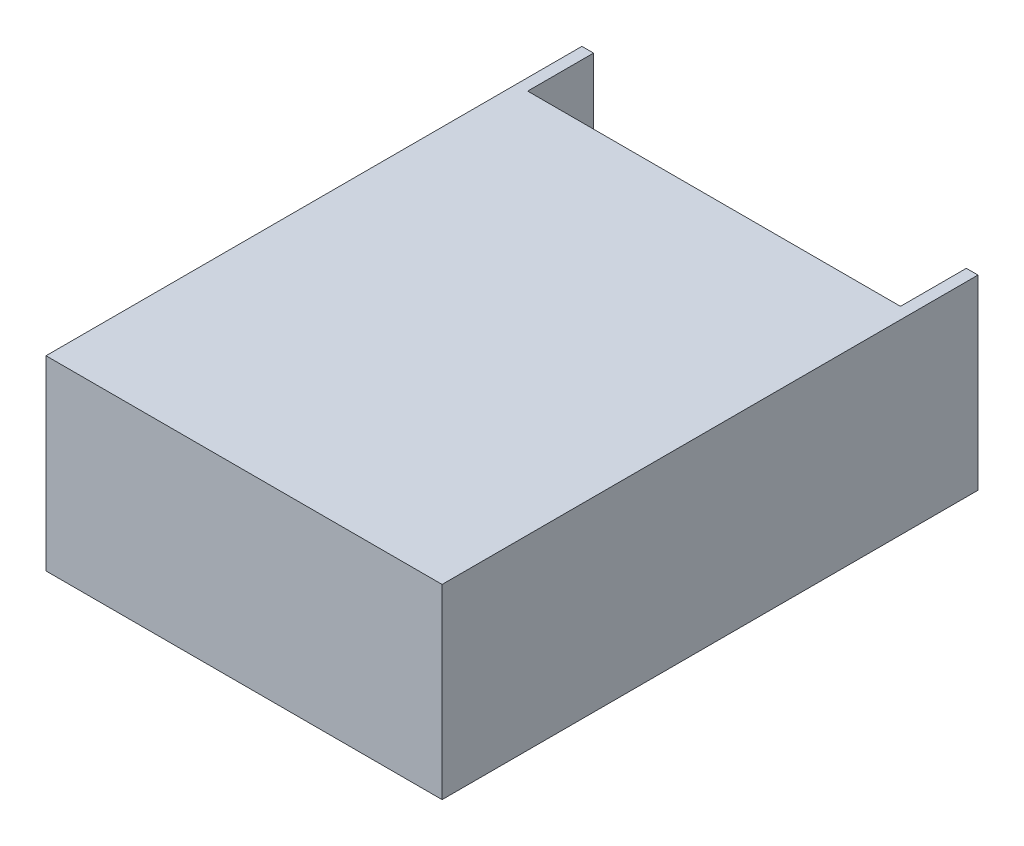
ISO-10303-21;
HEADER;
FILE_DESCRIPTION(('STEP AP214'),'2;1');
FILE_NAME('part.step','',(''),(''),'','','');
FILE_SCHEMA(('AUTOMOTIVE_DESIGN { 1 0 10303 214 1 1 1 1 }'));
ENDSEC;
DATA;
#1=APPLICATION_CONTEXT('core data for automotive mechanical design processes');
#2=APPLICATION_PROTOCOL_DEFINITION('international standard','automotive_design',2000,#1);
#3=PRODUCT_CONTEXT('',#1,'mechanical');
#4=PRODUCT('Part','Part','',(#3));
#5=PRODUCT_RELATED_PRODUCT_CATEGORY('part','',(#4));
#6=PRODUCT_DEFINITION_FORMATION('','',#4);
#7=PRODUCT_DEFINITION_CONTEXT('part definition',#1,'design');
#8=PRODUCT_DEFINITION('design','',#6,#7);
#9=PRODUCT_DEFINITION_SHAPE('','',#8);
#10=(LENGTH_UNIT() NAMED_UNIT(*) SI_UNIT(.MILLI.,.METRE.));
#11=(NAMED_UNIT(*) PLANE_ANGLE_UNIT() SI_UNIT($,.RADIAN.));
#12=(NAMED_UNIT(*) SI_UNIT($,.STERADIAN.) SOLID_ANGLE_UNIT());
#13=UNCERTAINTY_MEASURE_WITH_UNIT(LENGTH_MEASURE(1.E-05),#10,'distance_accuracy_value','');
#14=(GEOMETRIC_REPRESENTATION_CONTEXT(3) GLOBAL_UNCERTAINTY_ASSIGNED_CONTEXT((#13)) GLOBAL_UNIT_ASSIGNED_CONTEXT((#10,
#11,#12)) REPRESENTATION_CONTEXT('',''));
#15=CARTESIAN_POINT('',(0.,0.,0.));
#16=DIRECTION('',(0.,0.,1.));
#17=DIRECTION('',(1.,0.,0.));
#18=AXIS2_PLACEMENT_3D('',#15,#16,#17);
#19=CARTESIAN_POINT('',(0.,0.5,-23.));
#20=DIRECTION('',(0.,0.,-1.));
#21=DIRECTION('',(-1.,0.,0.));
#22=AXIS2_PLACEMENT_3D('',#19,#20,#21);
#23=PLANE('',#22);
#24=DIRECTION('',(0.,1.,0.));
#25=VECTOR('',#24,1.);
#26=CARTESIAN_POINT('',(10.7860933901248,0.,-23.));
#27=LINE('',#26,#25);
#28=CARTESIAN_POINT('',(10.7860933901248,0.,-23.));
#29=VERTEX_POINT('',#28);
#30=CARTESIAN_POINT('',(10.7860933901248,0.5,-23.));
#31=VERTEX_POINT('',#30);
#32=EDGE_CURVE('E158',#29,#31,#27,.T.);
#33=ORIENTED_EDGE('',*,*,#32,.F.);
#34=DIRECTION('',(1.,0.,0.));
#35=VECTOR('',#34,1.);
#36=CARTESIAN_POINT('',(0.,0.,-23.));
#37=LINE('',#36,#35);
#38=CARTESIAN_POINT('',(5.53846992642918,0.,-23.));
#39=VERTEX_POINT('',#38);
#40=EDGE_CURVE('E169',#39,#29,#37,.T.);
#41=ORIENTED_EDGE('',*,*,#40,.F.);
#42=DIRECTION('',(0.,1.,0.));
#43=VECTOR('',#42,1.);
#44=CARTESIAN_POINT('',(5.53846992642918,0.,-23.));
#45=LINE('',#44,#43);
#46=CARTESIAN_POINT('',(5.53846992642918,0.5,-23.));
#47=VERTEX_POINT('',#46);
#48=EDGE_CURVE('E313',#39,#47,#45,.T.);
#49=ORIENTED_EDGE('',*,*,#48,.T.);
#50=DIRECTION('',(1.,0.,0.));
#51=VECTOR('',#50,1.);
#52=CARTESIAN_POINT('',(0.,0.5,-23.));
#53=LINE('',#52,#51);
#54=EDGE_CURVE('E171',#47,#31,#53,.T.);
#55=ORIENTED_EDGE('',*,*,#54,.T.);
#56=EDGE_LOOP('',(#33,#41,#49,#55));
#57=FACE_BOUND('',#56,.T.);
#58=ADVANCED_FACE('F39',(#57),#23,.T.);
#59=DIRECTION('',(0.,1.,0.));
#60=VECTOR('',#59,1.);
#61=CARTESIAN_POINT('',(13.1501217821858,0.,-23.));
#62=LINE('',#61,#60);
#63=CARTESIAN_POINT('',(13.1501217821858,0.,-23.));
#64=VERTEX_POINT('',#63);
#65=CARTESIAN_POINT('',(13.1501217821858,0.5,-23.));
#66=VERTEX_POINT('',#65);
#67=EDGE_CURVE('E173',#64,#66,#62,.T.);
#68=ORIENTED_EDGE('',*,*,#67,.T.);
#69=CARTESIAN_POINT('',(16.5,0.5,-23.));
#70=VERTEX_POINT('',#69);
#71=EDGE_CURVE('E203',#66,#70,#53,.T.);
#72=ORIENTED_EDGE('',*,*,#71,.T.);
#73=DIRECTION('',(0.,-1.,0.));
#74=VECTOR('',#73,1.);
#75=CARTESIAN_POINT('',(16.5,8.,-23.));
#76=LINE('',#75,#74);
#77=CARTESIAN_POINT('',(16.5,8.,-23.));
#78=VERTEX_POINT('',#77);
#79=EDGE_CURVE('E231',#78,#70,#76,.T.);
#80=ORIENTED_EDGE('',*,*,#79,.F.);
#81=DIRECTION('',(-1.,0.,0.));
#82=VECTOR('',#81,1.);
#83=CARTESIAN_POINT('',(16.5,8.,-23.));
#84=LINE('',#83,#82);
#85=CARTESIAN_POINT('',(17.,8.,-23.));
#86=VERTEX_POINT('',#85);
#87=EDGE_CURVE('E245',#86,#78,#84,.T.);
#88=ORIENTED_EDGE('',*,*,#87,.F.);
#89=DIRECTION('',(0.,-1.,0.));
#90=VECTOR('',#89,1.);
#91=CARTESIAN_POINT('',(17.,0.5,-23.));
#92=LINE('',#91,#90);
#93=CARTESIAN_POINT('',(17.,0.,-23.));
#94=VERTEX_POINT('',#93);
#95=EDGE_CURVE('E43',#86,#94,#92,.T.);
#96=ORIENTED_EDGE('',*,*,#95,.T.);
#97=EDGE_CURVE('E184',#64,#94,#37,.T.);
#98=ORIENTED_EDGE('',*,*,#97,.F.);
#99=EDGE_LOOP('',(#68,#72,#80,#88,#96,#98));
#100=FACE_BOUND('',#99,.T.);
#101=ADVANCED_FACE('F230',(#100),#23,.T.);
#102=CARTESIAN_POINT('',(0.,0.5,0.));
#103=DIRECTION('',(0.,1.,0.));
#104=DIRECTION('',(0.,0.,1.));
#105=AXIS2_PLACEMENT_3D('',#102,#103,#104);
#106=PLANE('',#105);
#107=DIRECTION('',(0.,0.,-1.));
#108=VECTOR('',#107,1.);
#109=CARTESIAN_POINT('',(0.5,0.5,0.));
#110=LINE('',#109,#108);
#111=CARTESIAN_POINT('',(0.5,0.5,-20.1723435476145));
#112=VERTEX_POINT('',#111);
#113=CARTESIAN_POINT('',(0.5,0.5,-23.));
#114=VERTEX_POINT('',#113);
#115=EDGE_CURVE('E244',#112,#114,#110,.T.);
#116=ORIENTED_EDGE('',*,*,#115,.F.);
#117=DIRECTION('',(-1.,0.,0.));
#118=VECTOR('',#117,1.);
#119=CARTESIAN_POINT('',(0.5,0.5,-20.1723435476145));
#120=LINE('',#119,#118);
#121=CARTESIAN_POINT('',(16.5,0.5,-20.1723435476145));
#122=VERTEX_POINT('',#121);
#123=EDGE_CURVE('E250',#122,#112,#120,.T.);
#124=ORIENTED_EDGE('',*,*,#123,.F.);
#125=DIRECTION('',(0.,0.,1.));
#126=VECTOR('',#125,1.);
#127=CARTESIAN_POINT('',(16.5,0.5,-23.));
#128=LINE('',#127,#126);
#129=EDGE_CURVE('E240',#70,#122,#128,.T.);
#130=ORIENTED_EDGE('',*,*,#129,.F.);
#131=ORIENTED_EDGE('',*,*,#71,.F.);
#132=DIRECTION('',(0.,0.,-1.));
#133=VECTOR('',#132,1.);
#134=CARTESIAN_POINT('',(13.1501217821858,0.5,-23.));
#135=LINE('',#134,#133);
#136=CARTESIAN_POINT('',(13.1501217821858,0.5,-23.4576161489814));
#137=VERTEX_POINT('',#136);
#138=EDGE_CURVE('E391',#66,#137,#135,.T.);
#139=ORIENTED_EDGE('',*,*,#138,.T.);
#140=DIRECTION('',(-1.,0.,0.));
#141=VECTOR('',#140,1.);
#142=CARTESIAN_POINT('',(10.7860933901248,0.5,-23.4576161489814));
#143=LINE('',#142,#141);
#144=CARTESIAN_POINT('',(10.7860933901248,0.5,-23.4576161489814));
#145=VERTEX_POINT('',#144);
#146=EDGE_CURVE('E164',#137,#145,#143,.T.);
#147=ORIENTED_EDGE('',*,*,#146,.T.);
#148=DIRECTION('',(0.,0.,1.));
#149=VECTOR('',#148,1.);
#150=CARTESIAN_POINT('',(10.7860933901248,0.5,-23.));
#151=LINE('',#150,#149);
#152=EDGE_CURVE('E394',#145,#31,#151,.T.);
#153=ORIENTED_EDGE('',*,*,#152,.T.);
#154=ORIENTED_EDGE('',*,*,#54,.F.);
#155=DIRECTION('',(0.,0.,-1.));
#156=VECTOR('',#155,1.);
#157=CARTESIAN_POINT('',(5.53846992642918,0.5,-23.));
#158=LINE('',#157,#156);
#159=CARTESIAN_POINT('',(5.53846992642918,0.5,-23.4576161489814));
#160=VERTEX_POINT('',#159);
#161=EDGE_CURVE('E65',#47,#160,#158,.T.);
#162=ORIENTED_EDGE('',*,*,#161,.T.);
#163=DIRECTION('',(-1.,0.,0.));
#164=VECTOR('',#163,1.);
#165=CARTESIAN_POINT('',(3.04454986447481,0.5,-23.4576161489814));
#166=LINE('',#165,#164);
#167=CARTESIAN_POINT('',(3.04454986447481,0.5,-23.4576161489814));
#168=VERTEX_POINT('',#167);
#169=EDGE_CURVE('E291',#160,#168,#166,.T.);
#170=ORIENTED_EDGE('',*,*,#169,.T.);
#171=DIRECTION('',(0.,0.,1.));
#172=VECTOR('',#171,1.);
#173=CARTESIAN_POINT('',(3.04454986447481,0.5,-23.));
#174=LINE('',#173,#172);
#175=CARTESIAN_POINT('',(3.04454986447481,0.5,-23.));
#176=VERTEX_POINT('',#175);
#177=EDGE_CURVE('E289',#168,#176,#174,.T.);
#178=ORIENTED_EDGE('',*,*,#177,.T.);
#179=EDGE_CURVE('E192',#114,#176,#53,.T.);
#180=ORIENTED_EDGE('',*,*,#179,.F.);
#181=EDGE_LOOP('',(#116,#124,#130,#131,#139,#147,#153,#154,#162,#170,#178,#180));
#182=FACE_BOUND('',#181,.T.);
#183=ADVANCED_FACE('F249',(#182),#106,.T.);
#184=CARTESIAN_POINT('',(0.5,8.,0.));
#185=DIRECTION('',(-1.,0.,0.));
#186=DIRECTION('',(0.,0.,1.));
#187=AXIS2_PLACEMENT_3D('',#184,#185,#186);
#188=PLANE('',#187);
#189=DIRECTION('',(0.,-1.,0.));
#190=VECTOR('',#189,1.);
#191=CARTESIAN_POINT('',(0.5,8.,-20.1723435476145));
#192=LINE('',#191,#190);
#193=CARTESIAN_POINT('',(0.5,8.,-20.1723435476145));
#194=VERTEX_POINT('',#193);
#195=EDGE_CURVE('E258',#194,#112,#192,.T.);
#196=ORIENTED_EDGE('',*,*,#195,.T.);
#197=ORIENTED_EDGE('',*,*,#115,.T.);
#198=DIRECTION('',(0.,-1.,0.));
#199=VECTOR('',#198,1.);
#200=CARTESIAN_POINT('',(0.5,8.,-23.));
#201=LINE('',#200,#199);
#202=CARTESIAN_POINT('',(0.5,8.,-23.));
#203=VERTEX_POINT('',#202);
#204=EDGE_CURVE('E189',#203,#114,#201,.T.);
#205=ORIENTED_EDGE('',*,*,#204,.F.);
#206=DIRECTION('',(0.,0.,-1.));
#207=VECTOR('',#206,1.);
#208=CARTESIAN_POINT('',(0.5,8.,0.));
#209=LINE('',#208,#207);
#210=EDGE_CURVE('E270',#194,#203,#209,.T.);
#211=ORIENTED_EDGE('',*,*,#210,.F.);
#212=EDGE_LOOP('',(#196,#197,#205,#211));
#213=FACE_BOUND('',#212,.T.);
#214=ADVANCED_FACE('F284',(#213),#188,.F.);
#215=CARTESIAN_POINT('',(16.5,8.,-23.));
#216=DIRECTION('',(1.,0.,0.));
#217=DIRECTION('',(0.,0.,-1.));
#218=AXIS2_PLACEMENT_3D('',#215,#216,#217);
#219=PLANE('',#218);
#220=DIRECTION('',(0.,-1.,0.));
#221=VECTOR('',#220,1.);
#222=CARTESIAN_POINT('',(16.5,8.,-20.1723435476145));
#223=LINE('',#222,#221);
#224=CARTESIAN_POINT('',(16.5,8.,-20.1723435476145));
#225=VERTEX_POINT('',#224);
#226=EDGE_CURVE('E252',#225,#122,#223,.T.);
#227=ORIENTED_EDGE('',*,*,#226,.F.);
#228=DIRECTION('',(0.,0.,1.));
#229=VECTOR('',#228,1.);
#230=CARTESIAN_POINT('',(16.5,8.,-23.));
#231=LINE('',#230,#229);
#232=EDGE_CURVE('E242',#78,#225,#231,.T.);
#233=ORIENTED_EDGE('',*,*,#232,.F.);
#234=ORIENTED_EDGE('',*,*,#79,.T.);
#235=ORIENTED_EDGE('',*,*,#129,.T.);
#236=EDGE_LOOP('',(#227,#233,#234,#235));
#237=FACE_BOUND('',#236,.T.);
#238=ADVANCED_FACE('F239',(#237),#219,.F.);
#239=DIRECTION('',(0.,1.,0.));
#240=VECTOR('',#239,1.);
#241=CARTESIAN_POINT('',(3.04454986447481,0.,-23.));
#242=LINE('',#241,#240);
#243=CARTESIAN_POINT('',(3.04454986447481,0.,-23.));
#244=VERTEX_POINT('',#243);
#245=EDGE_CURVE('E316',#244,#176,#242,.T.);
#246=ORIENTED_EDGE('',*,*,#245,.F.);
#247=CARTESIAN_POINT('',(0.,0.,-23.));
#248=VERTEX_POINT('',#247);
#249=EDGE_CURVE('E183',#248,#244,#37,.T.);
#250=ORIENTED_EDGE('',*,*,#249,.F.);
#251=DIRECTION('',(0.,-1.,0.));
#252=VECTOR('',#251,1.);
#253=CARTESIAN_POINT('',(0.,0.5,-23.));
#254=LINE('',#253,#252);
#255=CARTESIAN_POINT('',(0.,8.,-23.));
#256=VERTEX_POINT('',#255);
#257=EDGE_CURVE('E11',#256,#248,#254,.T.);
#258=ORIENTED_EDGE('',*,*,#257,.F.);
#259=DIRECTION('',(-1.,0.,0.));
#260=VECTOR('',#259,1.);
#261=CARTESIAN_POINT('',(0.,8.,-23.));
#262=LINE('',#261,#260);
#263=EDGE_CURVE('E273',#203,#256,#262,.T.);
#264=ORIENTED_EDGE('',*,*,#263,.F.);
#265=ORIENTED_EDGE('',*,*,#204,.T.);
#266=ORIENTED_EDGE('',*,*,#179,.T.);
#267=EDGE_LOOP('',(#246,#250,#258,#264,#265,#266));
#268=FACE_BOUND('',#267,.T.);
#269=ADVANCED_FACE('F41',(#268),#23,.T.);
#270=CARTESIAN_POINT('',(0.,0.5,0.));
#271=DIRECTION('',(-1.,0.,0.));
#272=DIRECTION('',(0.,0.,1.));
#273=AXIS2_PLACEMENT_3D('',#270,#271,#272);
#274=PLANE('',#273);
#275=DIRECTION('',(0.,0.,-1.));
#276=VECTOR('',#275,1.);
#277=CARTESIAN_POINT('',(0.,0.,0.));
#278=LINE('',#277,#276);
#279=CARTESIAN_POINT('',(0.,0.,0.));
#280=VERTEX_POINT('',#279);
#281=EDGE_CURVE('E200',#280,#248,#278,.T.);
#282=ORIENTED_EDGE('',*,*,#281,.F.);
#283=DIRECTION('',(0.,-1.,0.));
#284=VECTOR('',#283,1.);
#285=CARTESIAN_POINT('',(0.,0.5,0.));
#286=LINE('',#285,#284);
#287=CARTESIAN_POINT('',(0.,8.,0.));
#288=VERTEX_POINT('',#287);
#289=EDGE_CURVE('E49',#288,#280,#286,.T.);
#290=ORIENTED_EDGE('',*,*,#289,.F.);
#291=DIRECTION('',(0.,0.,1.));
#292=VECTOR('',#291,1.);
#293=CARTESIAN_POINT('',(0.,8.,0.));
#294=LINE('',#293,#292);
#295=EDGE_CURVE('E263',#256,#288,#294,.T.);
#296=ORIENTED_EDGE('',*,*,#295,.F.);
#297=ORIENTED_EDGE('',*,*,#257,.T.);
#298=EDGE_LOOP('',(#282,#290,#296,#297));
#299=FACE_BOUND('',#298,.T.);
#300=ADVANCED_FACE('F348',(#299),#274,.T.);
#301=CARTESIAN_POINT('',(0.,0.5,0.));
#302=DIRECTION('',(0.,0.,-1.));
#303=DIRECTION('',(-1.,0.,0.));
#304=AXIS2_PLACEMENT_3D('',#301,#302,#303);
#305=PLANE('',#304);
#306=DIRECTION('',(1.,0.,0.));
#307=VECTOR('',#306,1.);
#308=CARTESIAN_POINT('',(0.,0.,0.));
#309=LINE('',#308,#307);
#310=CARTESIAN_POINT('',(17.,0.,0.));
#311=VERTEX_POINT('',#310);
#312=EDGE_CURVE('E197',#280,#311,#309,.T.);
#313=ORIENTED_EDGE('',*,*,#312,.T.);
#314=DIRECTION('',(0.,-1.,0.));
#315=VECTOR('',#314,1.);
#316=CARTESIAN_POINT('',(17.,0.5,0.));
#317=LINE('',#316,#315);
#318=CARTESIAN_POINT('',(17.,8.,0.));
#319=VERTEX_POINT('',#318);
#320=EDGE_CURVE('E206',#319,#311,#317,.T.);
#321=ORIENTED_EDGE('',*,*,#320,.F.);
#322=DIRECTION('',(1.,0.,0.));
#323=VECTOR('',#322,1.);
#324=CARTESIAN_POINT('',(0.,8.,0.));
#325=LINE('',#324,#323);
#326=EDGE_CURVE('E267',#288,#319,#325,.T.);
#327=ORIENTED_EDGE('',*,*,#326,.F.);
#328=ORIENTED_EDGE('',*,*,#289,.T.);
#329=EDGE_LOOP('',(#313,#321,#327,#328));
#330=FACE_BOUND('',#329,.T.);
#331=ADVANCED_FACE('F353',(#330),#305,.F.);
#332=CARTESIAN_POINT('',(17.,0.5,0.));
#333=DIRECTION('',(-1.,0.,0.));
#334=DIRECTION('',(0.,0.,1.));
#335=AXIS2_PLACEMENT_3D('',#332,#333,#334);
#336=PLANE('',#335);
#337=DIRECTION('',(0.,0.,-1.));
#338=VECTOR('',#337,1.);
#339=CARTESIAN_POINT('',(17.,0.,0.));
#340=LINE('',#339,#338);
#341=EDGE_CURVE('E188',#311,#94,#340,.T.);
#342=ORIENTED_EDGE('',*,*,#341,.T.);
#343=ORIENTED_EDGE('',*,*,#95,.F.);
#344=DIRECTION('',(0.,0.,-1.));
#345=VECTOR('',#344,1.);
#346=CARTESIAN_POINT('',(17.,8.,-23.));
#347=LINE('',#346,#345);
#348=EDGE_CURVE('E256',#319,#86,#347,.T.);
#349=ORIENTED_EDGE('',*,*,#348,.F.);
#350=ORIENTED_EDGE('',*,*,#320,.T.);
#351=EDGE_LOOP('',(#342,#343,#349,#350));
#352=FACE_BOUND('',#351,.T.);
#353=ADVANCED_FACE('F364',(#352),#336,.F.);
#354=CARTESIAN_POINT('',(0.,0.,0.));
#355=DIRECTION('',(0.,1.,0.));
#356=DIRECTION('',(0.,0.,1.));
#357=AXIS2_PLACEMENT_3D('',#354,#355,#356);
#358=PLANE('',#357);
#359=ORIENTED_EDGE('',*,*,#249,.T.);
#360=DIRECTION('',(0.,0.,1.));
#361=VECTOR('',#360,1.);
#362=CARTESIAN_POINT('',(3.04454986447481,0.,-23.));
#363=LINE('',#362,#361);
#364=CARTESIAN_POINT('',(3.04454986447481,0.,-23.4576161489814));
#365=VERTEX_POINT('',#364);
#366=EDGE_CURVE('E306',#365,#244,#363,.T.);
#367=ORIENTED_EDGE('',*,*,#366,.F.);
#368=DIRECTION('',(-1.,0.,0.));
#369=VECTOR('',#368,1.);
#370=CARTESIAN_POINT('',(3.04454986447481,0.,-23.4576161489814));
#371=LINE('',#370,#369);
#372=CARTESIAN_POINT('',(5.53846992642918,0.,-23.4576161489814));
#373=VERTEX_POINT('',#372);
#374=EDGE_CURVE('E301',#373,#365,#371,.T.);
#375=ORIENTED_EDGE('',*,*,#374,.F.);
#376=DIRECTION('',(0.,0.,-1.));
#377=VECTOR('',#376,1.);
#378=CARTESIAN_POINT('',(5.53846992642918,0.,-23.));
#379=LINE('',#378,#377);
#380=EDGE_CURVE('E181',#39,#373,#379,.T.);
#381=ORIENTED_EDGE('',*,*,#380,.F.);
#382=ORIENTED_EDGE('',*,*,#40,.T.);
#383=DIRECTION('',(0.,0.,1.));
#384=VECTOR('',#383,1.);
#385=CARTESIAN_POINT('',(10.7860933901248,0.,-23.));
#386=LINE('',#385,#384);
#387=CARTESIAN_POINT('',(10.7860933901248,0.,-23.4576161489814));
#388=VERTEX_POINT('',#387);
#389=EDGE_CURVE('E154',#388,#29,#386,.T.);
#390=ORIENTED_EDGE('',*,*,#389,.F.);
#391=DIRECTION('',(-1.,0.,0.));
#392=VECTOR('',#391,1.);
#393=CARTESIAN_POINT('',(10.7860933901248,0.,-23.4576161489814));
#394=LINE('',#393,#392);
#395=CARTESIAN_POINT('',(13.1501217821858,0.,-23.4576161489814));
#396=VERTEX_POINT('',#395);
#397=EDGE_CURVE('E174',#396,#388,#394,.T.);
#398=ORIENTED_EDGE('',*,*,#397,.F.);
#399=DIRECTION('',(0.,0.,-1.));
#400=VECTOR('',#399,1.);
#401=CARTESIAN_POINT('',(13.1501217821858,0.,-23.));
#402=LINE('',#401,#400);
#403=EDGE_CURVE('E57',#64,#396,#402,.T.);
#404=ORIENTED_EDGE('',*,*,#403,.F.);
#405=ORIENTED_EDGE('',*,*,#97,.T.);
#406=ORIENTED_EDGE('',*,*,#341,.F.);
#407=ORIENTED_EDGE('',*,*,#312,.F.);
#408=ORIENTED_EDGE('',*,*,#281,.T.);
#409=EDGE_LOOP('',(#359,#367,#375,#381,#382,#390,#398,#404,#405,#406,#407,#408));
#410=FACE_BOUND('',#409,.T.);
#411=ADVANCED_FACE('F178',(#410),#358,.F.);
#412=CARTESIAN_POINT('',(0.,8.,0.));
#413=DIRECTION('',(0.,-1.,0.));
#414=DIRECTION('',(0.,0.,-1.));
#415=AXIS2_PLACEMENT_3D('',#412,#413,#414);
#416=PLANE('',#415);
#417=ORIENTED_EDGE('',*,*,#295,.T.);
#418=ORIENTED_EDGE('',*,*,#326,.T.);
#419=ORIENTED_EDGE('',*,*,#348,.T.);
#420=ORIENTED_EDGE('',*,*,#87,.T.);
#421=ORIENTED_EDGE('',*,*,#232,.T.);
#422=DIRECTION('',(-1.,0.,0.));
#423=VECTOR('',#422,1.);
#424=CARTESIAN_POINT('',(0.5,8.,-20.1723435476145));
#425=LINE('',#424,#423);
#426=EDGE_CURVE('E319',#225,#194,#425,.T.);
#427=ORIENTED_EDGE('',*,*,#426,.T.);
#428=ORIENTED_EDGE('',*,*,#210,.T.);
#429=ORIENTED_EDGE('',*,*,#263,.T.);
#430=EDGE_LOOP('',(#417,#418,#419,#420,#421,#427,#428,#429));
#431=FACE_BOUND('',#430,.T.);
#432=ADVANCED_FACE('F329',(#431),#416,.F.);
#433=CARTESIAN_POINT('',(0.5,8.,-20.1723435476145));
#434=DIRECTION('',(0.,0.,1.));
#435=DIRECTION('',(1.,0.,0.));
#436=AXIS2_PLACEMENT_3D('',#433,#434,#435);
#437=PLANE('',#436);
#438=ORIENTED_EDGE('',*,*,#123,.T.);
#439=ORIENTED_EDGE('',*,*,#195,.F.);
#440=ORIENTED_EDGE('',*,*,#426,.F.);
#441=ORIENTED_EDGE('',*,*,#226,.T.);
#442=EDGE_LOOP('',(#438,#439,#440,#441));
#443=FACE_BOUND('',#442,.T.);
#444=ADVANCED_FACE('F331',(#443),#437,.F.);
#445=CARTESIAN_POINT('',(3.04454986447481,0.,-23.));
#446=DIRECTION('',(-1.,0.,0.));
#447=DIRECTION('',(0.,0.,1.));
#448=AXIS2_PLACEMENT_3D('',#445,#446,#447);
#449=PLANE('',#448);
#450=ORIENTED_EDGE('',*,*,#177,.F.);
#451=DIRECTION('',(0.,1.,0.));
#452=VECTOR('',#451,1.);
#453=CARTESIAN_POINT('',(3.04454986447481,0.,-23.4576161489814));
#454=LINE('',#453,#452);
#455=EDGE_CURVE('E307',#365,#168,#454,.T.);
#456=ORIENTED_EDGE('',*,*,#455,.F.);
#457=ORIENTED_EDGE('',*,*,#366,.T.);
#458=ORIENTED_EDGE('',*,*,#245,.T.);
#459=EDGE_LOOP('',(#450,#456,#457,#458));
#460=FACE_BOUND('',#459,.T.);
#461=ADVANCED_FACE('F333',(#460),#449,.T.);
#462=CARTESIAN_POINT('',(3.04454986447481,0.,-23.4576161489814));
#463=DIRECTION('',(0.,0.,-1.));
#464=DIRECTION('',(-1.,0.,0.));
#465=AXIS2_PLACEMENT_3D('',#462,#463,#464);
#466=PLANE('',#465);
#467=ORIENTED_EDGE('',*,*,#169,.F.);
#468=DIRECTION('',(0.,1.,0.));
#469=VECTOR('',#468,1.);
#470=CARTESIAN_POINT('',(5.53846992642918,0.,-23.4576161489814));
#471=LINE('',#470,#469);
#472=EDGE_CURVE('E310',#373,#160,#471,.T.);
#473=ORIENTED_EDGE('',*,*,#472,.F.);
#474=ORIENTED_EDGE('',*,*,#374,.T.);
#475=ORIENTED_EDGE('',*,*,#455,.T.);
#476=EDGE_LOOP('',(#467,#473,#474,#475));
#477=FACE_BOUND('',#476,.T.);
#478=ADVANCED_FACE('F339',(#477),#466,.T.);
#479=CARTESIAN_POINT('',(5.53846992642918,0.,-23.));
#480=DIRECTION('',(1.,0.,0.));
#481=DIRECTION('',(0.,0.,-1.));
#482=AXIS2_PLACEMENT_3D('',#479,#480,#481);
#483=PLANE('',#482);
#484=ORIENTED_EDGE('',*,*,#161,.F.);
#485=ORIENTED_EDGE('',*,*,#48,.F.);
#486=ORIENTED_EDGE('',*,*,#380,.T.);
#487=ORIENTED_EDGE('',*,*,#472,.T.);
#488=EDGE_LOOP('',(#484,#485,#486,#487));
#489=FACE_BOUND('',#488,.T.);
#490=ADVANCED_FACE('F412',(#489),#483,.T.);
#491=CARTESIAN_POINT('',(10.7860933901248,0.,-23.));
#492=DIRECTION('',(-1.,0.,0.));
#493=DIRECTION('',(0.,0.,1.));
#494=AXIS2_PLACEMENT_3D('',#491,#492,#493);
#495=PLANE('',#494);
#496=ORIENTED_EDGE('',*,*,#152,.F.);
#497=DIRECTION('',(0.,1.,0.));
#498=VECTOR('',#497,1.);
#499=CARTESIAN_POINT('',(10.7860933901248,0.,-23.4576161489814));
#500=LINE('',#499,#498);
#501=EDGE_CURVE('E160',#388,#145,#500,.T.);
#502=ORIENTED_EDGE('',*,*,#501,.F.);
#503=ORIENTED_EDGE('',*,*,#389,.T.);
#504=ORIENTED_EDGE('',*,*,#32,.T.);
#505=EDGE_LOOP('',(#496,#502,#503,#504));
#506=FACE_BOUND('',#505,.T.);
#507=ADVANCED_FACE('F157',(#506),#495,.T.);
#508=CARTESIAN_POINT('',(10.7860933901248,0.,-23.4576161489814));
#509=DIRECTION('',(0.,0.,-1.));
#510=DIRECTION('',(-1.,0.,0.));
#511=AXIS2_PLACEMENT_3D('',#508,#509,#510);
#512=PLANE('',#511);
#513=ORIENTED_EDGE('',*,*,#146,.F.);
#514=DIRECTION('',(0.,1.,0.));
#515=VECTOR('',#514,1.);
#516=CARTESIAN_POINT('',(13.1501217821858,0.,-23.4576161489814));
#517=LINE('',#516,#515);
#518=EDGE_CURVE('E298',#396,#137,#517,.T.);
#519=ORIENTED_EDGE('',*,*,#518,.F.);
#520=ORIENTED_EDGE('',*,*,#397,.T.);
#521=ORIENTED_EDGE('',*,*,#501,.T.);
#522=EDGE_LOOP('',(#513,#519,#520,#521));
#523=FACE_BOUND('',#522,.T.);
#524=ADVANCED_FACE('F404',(#523),#512,.T.);
#525=CARTESIAN_POINT('',(13.1501217821858,0.,-23.));
#526=DIRECTION('',(1.,0.,0.));
#527=DIRECTION('',(0.,0.,-1.));
#528=AXIS2_PLACEMENT_3D('',#525,#526,#527);
#529=PLANE('',#528);
#530=ORIENTED_EDGE('',*,*,#138,.F.);
#531=ORIENTED_EDGE('',*,*,#67,.F.);
#532=ORIENTED_EDGE('',*,*,#403,.T.);
#533=ORIENTED_EDGE('',*,*,#518,.T.);
#534=EDGE_LOOP('',(#530,#531,#532,#533));
#535=FACE_BOUND('',#534,.T.);
#536=ADVANCED_FACE('F401',(#535),#529,.T.);
#537=CLOSED_SHELL('',(#58,#101,#183,#214,#238,#269,#300,#331,#353,#411,#432,#444,#461,#478,#490,
#507,#524,#536));
#538=MANIFOLD_SOLID_BREP('B2',#537);
#539=ADVANCED_BREP_SHAPE_REPRESENTATION('',(#18,#538),#14);
#540=SHAPE_DEFINITION_REPRESENTATION(#9,#539);
ENDSEC;
END-ISO-10303-21;
